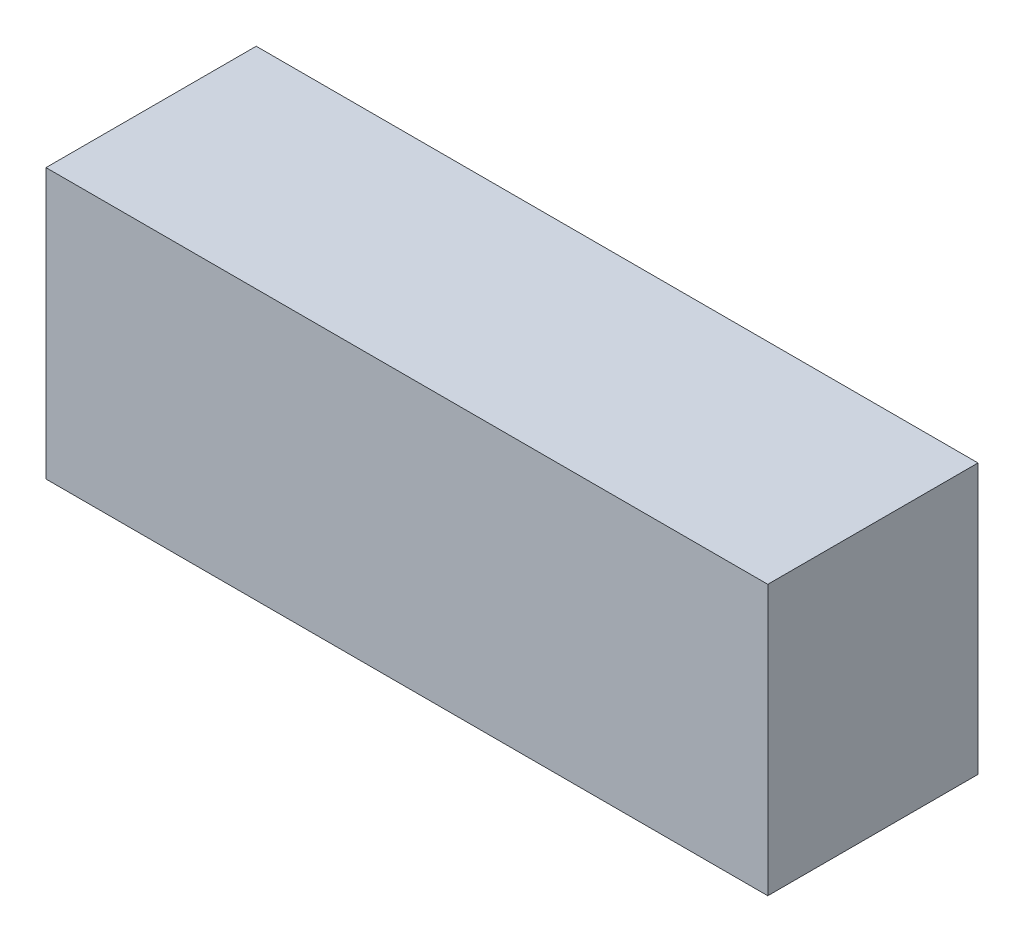
ISO-10303-21;
HEADER;
FILE_DESCRIPTION(('STEP AP214'),'2;1');
FILE_NAME('part.step','',(''),(''),'','','');
FILE_SCHEMA(('AUTOMOTIVE_DESIGN { 1 0 10303 214 1 1 1 1 }'));
ENDSEC;
DATA;
#1=APPLICATION_CONTEXT('core data for automotive mechanical design processes');
#2=APPLICATION_PROTOCOL_DEFINITION('international standard','automotive_design',2000,#1);
#3=PRODUCT_CONTEXT('',#1,'mechanical');
#4=PRODUCT('Part','Part','',(#3));
#5=PRODUCT_RELATED_PRODUCT_CATEGORY('part','',(#4));
#6=PRODUCT_DEFINITION_FORMATION('','',#4);
#7=PRODUCT_DEFINITION_CONTEXT('part definition',#1,'design');
#8=PRODUCT_DEFINITION('design','',#6,#7);
#9=PRODUCT_DEFINITION_SHAPE('','',#8);
#10=(LENGTH_UNIT() NAMED_UNIT(*) SI_UNIT(.MILLI.,.METRE.));
#11=(NAMED_UNIT(*) PLANE_ANGLE_UNIT() SI_UNIT($,.RADIAN.));
#12=(NAMED_UNIT(*) SI_UNIT($,.STERADIAN.) SOLID_ANGLE_UNIT());
#13=UNCERTAINTY_MEASURE_WITH_UNIT(LENGTH_MEASURE(1.E-05),#10,'distance_accuracy_value','');
#14=(GEOMETRIC_REPRESENTATION_CONTEXT(3) GLOBAL_UNCERTAINTY_ASSIGNED_CONTEXT((#13)) GLOBAL_UNIT_ASSIGNED_CONTEXT((#10,
#11,#12)) REPRESENTATION_CONTEXT('',''));
#15=CARTESIAN_POINT('',(0.,0.,0.));
#16=DIRECTION('',(0.,0.,1.));
#17=DIRECTION('',(1.,0.,0.));
#18=AXIS2_PLACEMENT_3D('',#15,#16,#17);
#19=CARTESIAN_POINT('',(0.,0.,56.5));
#20=DIRECTION('',(1.,0.,0.));
#21=DIRECTION('',(0.,0.,-1.));
#22=AXIS2_PLACEMENT_3D('',#19,#20,#21);
#23=PLANE('',#22);
#24=DIRECTION('',(0.,-1.,0.));
#25=VECTOR('',#24,1.);
#26=CARTESIAN_POINT('',(0.,0.,0.));
#27=LINE('',#26,#25);
#28=CARTESIAN_POINT('',(0.,72.5,0.));
#29=VERTEX_POINT('',#28);
#30=CARTESIAN_POINT('',(0.,0.,0.));
#31=VERTEX_POINT('',#30);
#32=EDGE_CURVE('E99',#29,#31,#27,.T.);
#33=ORIENTED_EDGE('',*,*,#32,.T.);
#34=DIRECTION('',(0.,0.,-1.));
#35=VECTOR('',#34,1.);
#36=CARTESIAN_POINT('',(0.,0.,56.5));
#37=LINE('',#36,#35);
#38=CARTESIAN_POINT('',(0.,0.,56.5));
#39=VERTEX_POINT('',#38);
#40=EDGE_CURVE('E11',#39,#31,#37,.T.);
#41=ORIENTED_EDGE('',*,*,#40,.F.);
#42=DIRECTION('',(0.,-1.,0.));
#43=VECTOR('',#42,1.);
#44=CARTESIAN_POINT('',(0.,0.,56.5));
#45=LINE('',#44,#43);
#46=CARTESIAN_POINT('',(0.,72.5,56.5));
#47=VERTEX_POINT('',#46);
#48=EDGE_CURVE('E87',#47,#39,#45,.T.);
#49=ORIENTED_EDGE('',*,*,#48,.F.);
#50=DIRECTION('',(0.,0.,-1.));
#51=VECTOR('',#50,1.);
#52=CARTESIAN_POINT('',(0.,72.5,56.5));
#53=LINE('',#52,#51);
#54=EDGE_CURVE('E95',#47,#29,#53,.T.);
#55=ORIENTED_EDGE('',*,*,#54,.T.);
#56=EDGE_LOOP('',(#33,#41,#49,#55));
#57=FACE_BOUND('',#56,.T.);
#58=ADVANCED_FACE('F36',(#57),#23,.F.);
#59=CARTESIAN_POINT('',(0.,0.,56.5));
#60=DIRECTION('',(0.,1.,0.));
#61=DIRECTION('',(0.,0.,1.));
#62=AXIS2_PLACEMENT_3D('',#59,#60,#61);
#63=PLANE('',#62);
#64=DIRECTION('',(1.,0.,0.));
#65=VECTOR('',#64,1.);
#66=CARTESIAN_POINT('',(0.,0.,0.));
#67=LINE('',#66,#65);
#68=CARTESIAN_POINT('',(194.,0.,0.));
#69=VERTEX_POINT('',#68);
#70=EDGE_CURVE('E91',#31,#69,#67,.T.);
#71=ORIENTED_EDGE('',*,*,#70,.T.);
#72=DIRECTION('',(0.,0.,-1.));
#73=VECTOR('',#72,1.);
#74=CARTESIAN_POINT('',(194.,0.,56.5));
#75=LINE('',#74,#73);
#76=CARTESIAN_POINT('',(194.,0.,56.5));
#77=VERTEX_POINT('',#76);
#78=EDGE_CURVE('E44',#77,#69,#75,.T.);
#79=ORIENTED_EDGE('',*,*,#78,.F.);
#80=DIRECTION('',(1.,0.,0.));
#81=VECTOR('',#80,1.);
#82=CARTESIAN_POINT('',(0.,0.,56.5));
#83=LINE('',#82,#81);
#84=EDGE_CURVE('E82',#39,#77,#83,.T.);
#85=ORIENTED_EDGE('',*,*,#84,.F.);
#86=ORIENTED_EDGE('',*,*,#40,.T.);
#87=EDGE_LOOP('',(#71,#79,#85,#86));
#88=FACE_BOUND('',#87,.T.);
#89=ADVANCED_FACE('F90',(#88),#63,.F.);
#90=CARTESIAN_POINT('',(194.,0.,56.5));
#91=DIRECTION('',(-1.,0.,0.));
#92=DIRECTION('',(0.,0.,1.));
#93=AXIS2_PLACEMENT_3D('',#90,#91,#92);
#94=PLANE('',#93);
#95=DIRECTION('',(0.,1.,0.));
#96=VECTOR('',#95,1.);
#97=CARTESIAN_POINT('',(194.,0.,0.));
#98=LINE('',#97,#96);
#99=CARTESIAN_POINT('',(194.,72.5,0.));
#100=VERTEX_POINT('',#99);
#101=EDGE_CURVE('E69',#69,#100,#98,.T.);
#102=ORIENTED_EDGE('',*,*,#101,.T.);
#103=DIRECTION('',(0.,0.,-1.));
#104=VECTOR('',#103,1.);
#105=CARTESIAN_POINT('',(194.,72.5,56.5));
#106=LINE('',#105,#104);
#107=CARTESIAN_POINT('',(194.,72.5,56.5));
#108=VERTEX_POINT('',#107);
#109=EDGE_CURVE('E92',#108,#100,#106,.T.);
#110=ORIENTED_EDGE('',*,*,#109,.F.);
#111=DIRECTION('',(0.,1.,0.));
#112=VECTOR('',#111,1.);
#113=CARTESIAN_POINT('',(194.,0.,56.5));
#114=LINE('',#113,#112);
#115=EDGE_CURVE('E85',#77,#108,#114,.T.);
#116=ORIENTED_EDGE('',*,*,#115,.F.);
#117=ORIENTED_EDGE('',*,*,#78,.T.);
#118=EDGE_LOOP('',(#102,#110,#116,#117));
#119=FACE_BOUND('',#118,.T.);
#120=ADVANCED_FACE('F93',(#119),#94,.F.);
#121=CARTESIAN_POINT('',(0.,72.5,56.5));
#122=DIRECTION('',(0.,-1.,0.));
#123=DIRECTION('',(0.,0.,-1.));
#124=AXIS2_PLACEMENT_3D('',#121,#122,#123);
#125=PLANE('',#124);
#126=DIRECTION('',(-1.,0.,0.));
#127=VECTOR('',#126,1.);
#128=CARTESIAN_POINT('',(0.,72.5,0.));
#129=LINE('',#128,#127);
#130=EDGE_CURVE('E75',#100,#29,#129,.T.);
#131=ORIENTED_EDGE('',*,*,#130,.T.);
#132=ORIENTED_EDGE('',*,*,#54,.F.);
#133=DIRECTION('',(-1.,0.,0.));
#134=VECTOR('',#133,1.);
#135=CARTESIAN_POINT('',(0.,72.5,56.5));
#136=LINE('',#135,#134);
#137=EDGE_CURVE('E52',#108,#47,#136,.T.);
#138=ORIENTED_EDGE('',*,*,#137,.F.);
#139=ORIENTED_EDGE('',*,*,#109,.T.);
#140=EDGE_LOOP('',(#131,#132,#138,#139));
#141=FACE_BOUND('',#140,.T.);
#142=ADVANCED_FACE('F106',(#141),#125,.F.);
#143=CARTESIAN_POINT('',(0.,0.,56.5));
#144=DIRECTION('',(0.,0.,-1.));
#145=DIRECTION('',(-1.,0.,0.));
#146=AXIS2_PLACEMENT_3D('',#143,#144,#145);
#147=PLANE('',#146);
#148=ORIENTED_EDGE('',*,*,#48,.T.);
#149=ORIENTED_EDGE('',*,*,#84,.T.);
#150=ORIENTED_EDGE('',*,*,#115,.T.);
#151=ORIENTED_EDGE('',*,*,#137,.T.);
#152=EDGE_LOOP('',(#148,#149,#150,#151));
#153=FACE_BOUND('',#152,.T.);
#154=ADVANCED_FACE('F83',(#153),#147,.F.);
#155=CARTESIAN_POINT('',(0.,0.,0.));
#156=DIRECTION('',(0.,0.,-1.));
#157=DIRECTION('',(-1.,0.,0.));
#158=AXIS2_PLACEMENT_3D('',#155,#156,#157);
#159=PLANE('',#158);
#160=ORIENTED_EDGE('',*,*,#32,.F.);
#161=ORIENTED_EDGE('',*,*,#130,.F.);
#162=ORIENTED_EDGE('',*,*,#101,.F.);
#163=ORIENTED_EDGE('',*,*,#70,.F.);
#164=EDGE_LOOP('',(#160,#161,#162,#163));
#165=FACE_BOUND('',#164,.T.);
#166=ADVANCED_FACE('F109',(#165),#159,.T.);
#167=CLOSED_SHELL('',(#58,#89,#120,#142,#154,#166));
#168=MANIFOLD_SOLID_BREP('B2',#167);
#169=ADVANCED_BREP_SHAPE_REPRESENTATION('',(#18,#168),#14);
#170=SHAPE_DEFINITION_REPRESENTATION(#9,#169);
ENDSEC;
END-ISO-10303-21;
